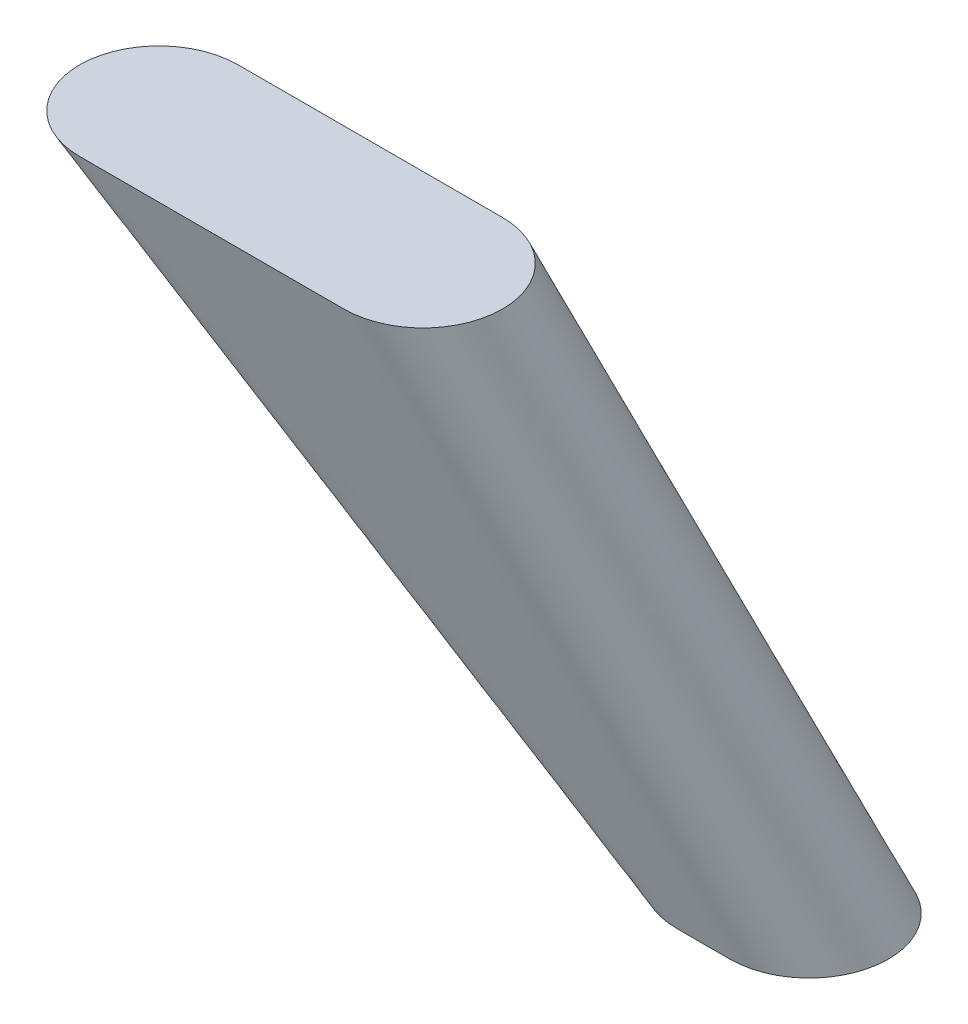
ISO-10303-21;
HEADER;
FILE_DESCRIPTION(('STEP AP214'),'2;1');
FILE_NAME('part.step','',(''),(''),'','','');
FILE_SCHEMA(('AUTOMOTIVE_DESIGN { 1 0 10303 214 1 1 1 1 }'));
ENDSEC;
DATA;
#1=APPLICATION_CONTEXT('core data for automotive mechanical design processes');
#2=APPLICATION_PROTOCOL_DEFINITION('international standard','automotive_design',2000,#1);
#3=PRODUCT_CONTEXT('',#1,'mechanical');
#4=PRODUCT('Part','Part','',(#3));
#5=PRODUCT_RELATED_PRODUCT_CATEGORY('part','',(#4));
#6=PRODUCT_DEFINITION_FORMATION('','',#4);
#7=PRODUCT_DEFINITION_CONTEXT('part definition',#1,'design');
#8=PRODUCT_DEFINITION('design','',#6,#7);
#9=PRODUCT_DEFINITION_SHAPE('','',#8);
#10=(LENGTH_UNIT() NAMED_UNIT(*) SI_UNIT(.MILLI.,.METRE.));
#11=(NAMED_UNIT(*) PLANE_ANGLE_UNIT() SI_UNIT($,.RADIAN.));
#12=(NAMED_UNIT(*) SI_UNIT($,.STERADIAN.) SOLID_ANGLE_UNIT());
#13=UNCERTAINTY_MEASURE_WITH_UNIT(LENGTH_MEASURE(1.E-05),#10,'distance_accuracy_value','');
#14=(GEOMETRIC_REPRESENTATION_CONTEXT(3) GLOBAL_UNCERTAINTY_ASSIGNED_CONTEXT((#13)) GLOBAL_UNIT_ASSIGNED_CONTEXT((#10,
#11,#12)) REPRESENTATION_CONTEXT('',''));
#15=CARTESIAN_POINT('',(0.,0.,0.));
#16=DIRECTION('',(0.,0.,1.));
#17=DIRECTION('',(1.,0.,0.));
#18=AXIS2_PLACEMENT_3D('',#15,#16,#17);
#19=CARTESIAN_POINT('',(-0.5,0.,0.));
#20=DIRECTION('',(0.,1.,0.));
#21=DIRECTION('',(0.,0.,1.));
#22=AXIS2_PLACEMENT_3D('',#19,#20,#21);
#23=PLANE('',#22);
#24=CARTESIAN_POINT('',(-0.5,0.,0.));
#25=DIRECTION('',(0.,1.,0.));
#26=DIRECTION('',(0.,0.,1.));
#27=AXIS2_PLACEMENT_3D('',#24,#25,#26);
#28=CIRCLE('',#27,1.5);
#29=CARTESIAN_POINT('',(-0.5,0.,-1.5));
#30=VERTEX_POINT('',#29);
#31=CARTESIAN_POINT('',(-0.5,0.,1.5));
#32=VERTEX_POINT('',#31);
#33=EDGE_CURVE('E176',#30,#32,#28,.T.);
#34=ORIENTED_EDGE('',*,*,#33,.F.);
#35=DIRECTION('',(-1.,0.,0.));
#36=VECTOR('',#35,1.);
#37=CARTESIAN_POINT('',(-0.5,0.,-1.5));
#38=LINE('',#37,#36);
#39=CARTESIAN_POINT('',(0.499999999999999,0.,-1.5));
#40=VERTEX_POINT('',#39);
#41=EDGE_CURVE('E184',#40,#30,#38,.T.);
#42=ORIENTED_EDGE('',*,*,#41,.F.);
#43=CARTESIAN_POINT('',(0.5,0.,0.));
#44=DIRECTION('',(0.,1.,0.));
#45=DIRECTION('',(0.,0.,1.));
#46=AXIS2_PLACEMENT_3D('',#43,#44,#45);
#47=CIRCLE('',#46,1.5);
#48=CARTESIAN_POINT('',(0.500000000000001,0.,1.5));
#49=VERTEX_POINT('',#48);
#50=EDGE_CURVE('E169',#49,#40,#47,.T.);
#51=ORIENTED_EDGE('',*,*,#50,.F.);
#52=DIRECTION('',(1.,0.,0.));
#53=VECTOR('',#52,1.);
#54=CARTESIAN_POINT('',(-0.5,0.,1.5));
#55=LINE('',#54,#53);
#56=EDGE_CURVE('E173',#32,#49,#55,.T.);
#57=ORIENTED_EDGE('',*,*,#56,.F.);
#58=EDGE_LOOP('',(#34,#42,#51,#57));
#59=FACE_BOUND('',#58,.T.);
#60=ADVANCED_FACE('F131',(#59),#23,.F.);
#61=CARTESIAN_POINT('',(-8.3,10.5,3.5));
#62=DIRECTION('',(0.,1.,0.));
#63=DIRECTION('',(0.,0.,1.));
#64=AXIS2_PLACEMENT_3D('',#61,#62,#63);
#65=PLANE('',#64);
#66=CARTESIAN_POINT('',(-8.3,10.5,3.5));
#67=DIRECTION('',(0.,1.,0.));
#68=DIRECTION('',(0.,0.,1.));
#69=AXIS2_PLACEMENT_3D('',#66,#67,#68);
#70=CIRCLE('',#69,1.5);
#71=CARTESIAN_POINT('',(-8.3,10.5,2.));
#72=VERTEX_POINT('',#71);
#73=CARTESIAN_POINT('',(-8.29999999999341,10.5,5.));
#74=VERTEX_POINT('',#73);
#75=EDGE_CURVE('E247',#72,#74,#70,.T.);
#76=ORIENTED_EDGE('',*,*,#75,.T.);
#77=DIRECTION('',(1.,0.,0.));
#78=VECTOR('',#77,1.);
#79=CARTESIAN_POINT('',(-8.3,10.5,5.));
#80=LINE('',#79,#78);
#81=CARTESIAN_POINT('',(-3.29999999991619,10.5,5.));
#82=VERTEX_POINT('',#81);
#83=EDGE_CURVE('E275',#74,#82,#80,.T.);
#84=ORIENTED_EDGE('',*,*,#83,.T.);
#85=CARTESIAN_POINT('',(-3.3,10.5,3.5));
#86=DIRECTION('',(0.,1.,0.));
#87=DIRECTION('',(0.,0.,1.));
#88=AXIS2_PLACEMENT_3D('',#85,#86,#87);
#89=CIRCLE('',#88,1.5);
#90=CARTESIAN_POINT('',(-3.3,10.5,2.));
#91=VERTEX_POINT('',#90);
#92=EDGE_CURVE('E142',#82,#91,#89,.T.);
#93=ORIENTED_EDGE('',*,*,#92,.T.);
#94=DIRECTION('',(-1.,0.,0.));
#95=VECTOR('',#94,1.);
#96=CARTESIAN_POINT('',(-8.3,10.5,2.));
#97=LINE('',#96,#95);
#98=EDGE_CURVE('E12',#91,#72,#97,.T.);
#99=ORIENTED_EDGE('',*,*,#98,.T.);
#100=EDGE_LOOP('',(#76,#84,#93,#99));
#101=FACE_BOUND('',#100,.T.);
#102=ADVANCED_FACE('F206',(#101),#65,.T.);
#103=CARTESIAN_POINT('',(-8.29999999891492,10.5,2.));
#104=CARTESIAN_POINT('',(-0.499999999361803,0.,-1.5));
#105=CARTESIAN_POINT('',(-8.02082364887283,10.5,2.));
#106=CARTESIAN_POINT('',(-0.335801066556987,0.,-1.5));
#107=CARTESIAN_POINT('',(-7.41053064299543,10.5,2.));
#108=CARTESIAN_POINT('',(-0.21524327309147,0.,-1.5));
#109=CARTESIAN_POINT('',(-5.8,10.5,2.));
#110=CARTESIAN_POINT('',(0.,0.,-1.5));
#111=CARTESIAN_POINT('',(-4.18946935700456,10.5,2.));
#112=CARTESIAN_POINT('',(0.21524327309147,0.,-1.5));
#113=CARTESIAN_POINT('',(-3.57917635112717,10.5,2.));
#114=CARTESIAN_POINT('',(0.335801066556986,0.,-1.5));
#115=CARTESIAN_POINT('',(-3.03490530349632,10.5,2.));
#116=CARTESIAN_POINT('',(0.655916739550319,0.,-1.5));
#117=CARTESIAN_POINT('',(-2.59425007172228,10.5,2.13008624908673));
#118=CARTESIAN_POINT('',(0.987820479615283,0.,-1.45144577340696));
#119=CARTESIAN_POINT('',(-2.13287848129319,10.5,2.50237550484088));
#120=CARTESIAN_POINT('',(1.49133360235256,0.,-1.17868140016491));
#121=CARTESIAN_POINT('',(-1.86060889529044,10.5,2.97881490364547));
#122=CARTESIAN_POINT('',(1.89396631949656,0.,-0.675979940046169));
#123=CARTESIAN_POINT('',(-1.76961596204744,10.5,3.49999999999999));
#124=CARTESIAN_POINT('',(2.0534597682229,0.,0.));
#125=CARTESIAN_POINT('',(-1.86060889529044,10.5,4.02118509635454));
#126=CARTESIAN_POINT('',(1.89396631949657,0.,0.675979940046167));
#127=CARTESIAN_POINT('',(-2.13287848129319,10.5,4.49762449515911));
#128=CARTESIAN_POINT('',(1.49133360235256,0.,1.17868140016491));
#129=CARTESIAN_POINT('',(-2.59425007172229,10.5,4.86991375091328));
#130=CARTESIAN_POINT('',(0.987820479615285,0.,1.45144577340695));
#131=CARTESIAN_POINT('',(-3.03490530349632,10.5,5.));
#132=CARTESIAN_POINT('',(0.65591673955032,0.,1.5));
#133=CARTESIAN_POINT('',(-3.57917635112717,10.5,5.));
#134=CARTESIAN_POINT('',(0.335801066556987,0.,1.5));
#135=CARTESIAN_POINT('',(-4.18946935700456,10.5,5.));
#136=CARTESIAN_POINT('',(0.21524327309147,0.,1.5));
#137=CARTESIAN_POINT('',(-5.8,10.5,5.));
#138=CARTESIAN_POINT('',(0.,0.,1.5));
#139=CARTESIAN_POINT('',(-7.41053064299543,10.5,5.));
#140=CARTESIAN_POINT('',(-0.21524327309147,0.,1.5));
#141=CARTESIAN_POINT('',(-8.02082364887283,10.5,5.));
#142=CARTESIAN_POINT('',(-0.335801066556986,0.,1.5));
#143=CARTESIAN_POINT('',(-8.56509469650368,10.5,5.));
#144=CARTESIAN_POINT('',(-0.655916739550319,0.,1.5));
#145=CARTESIAN_POINT('',(-9.00574992827771,10.5,4.86991375091327));
#146=CARTESIAN_POINT('',(-0.987820479615283,0.,1.45144577340696));
#147=CARTESIAN_POINT('',(-9.46712151870681,10.5,4.49762449515912));
#148=CARTESIAN_POINT('',(-1.49133360235256,0.,1.17868140016491));
#149=CARTESIAN_POINT('',(-9.73939110470955,10.5,4.02118509635452));
#150=CARTESIAN_POINT('',(-1.89396631949656,0.,0.67597994004617));
#151=CARTESIAN_POINT('',(-9.83038403795257,10.5,3.5));
#152=CARTESIAN_POINT('',(-2.0534597682229,0.,0.));
#153=CARTESIAN_POINT('',(-9.73939110470957,10.5,2.97881490364547));
#154=CARTESIAN_POINT('',(-1.89396631949656,0.,-0.675979940046165));
#155=CARTESIAN_POINT('',(-9.46712151870679,10.5,2.50237550484088));
#156=CARTESIAN_POINT('',(-1.49133360235256,0.,-1.17868140016491));
#157=CARTESIAN_POINT('',(-9.00574992827772,10.5,2.13008624908673));
#158=CARTESIAN_POINT('',(-0.987820479615287,0.,-1.45144577340695));
#159=CARTESIAN_POINT('',(-8.56509469650368,10.5,2.));
#160=CARTESIAN_POINT('',(-0.655916739550319,0.,-1.5));
#161=CARTESIAN_POINT('',(-8.29999999891492,10.5,2.));
#162=CARTESIAN_POINT('',(-0.499999999361803,0.,-1.5));
#163=B_SPLINE_SURFACE_WITH_KNOTS('',3,1,((#103,#104),(#105,#106),(#107,#108),(#109,#110),(#111,
#112),(#113,#114),(#115,#116),(#117,#118),(#119,#120),(#121,#122),(#123,#124),(#125,#126),(#127,
#128),(#129,#130),(#131,#132),(#133,#134),(#135,#136),(#137,#138),(#139,#140),(#141,#142),(#143,
#144),(#145,#146),(#147,#148),(#149,#150),(#151,#152),(#153,#154),(#155,#156),(#157,#158),(#159,
#160),(#161,#162)),.UNSPECIFIED.,.T.,.F.,.F.,(4,1,1,1,2,1,1,1,1,1,1,1,2,1,1,1,2,1,1,1,1,1,1,1,
4),(2,2),(0.,0.043116531631558,0.0862330632631159,0.129349594894674,0.172466126526232,
0.213407860710453,0.254349594894674,0.295291329078895,0.336233063263116,0.377174797447337,
0.418116531631558,0.459058265815779,0.5,0.543116531631558,0.586233063263116,0.629349594894674,
0.672466126526232,0.713407860710453,0.754349594894674,0.795291329078895,0.836233063263116,
0.877174797447337,0.918116531631558,0.959058265815779,1.),(0.,1.),.UNSPECIFIED.);
#164=ORIENTED_EDGE('',*,*,#92,.F.);
#165=ORIENTED_EDGE('',*,*,#83,.F.);
#166=ORIENTED_EDGE('',*,*,#75,.F.);
#167=ORIENTED_EDGE('',*,*,#98,.F.);
#168=EDGE_LOOP('',(#164,#165,#166,#167));
#169=FACE_BOUND('',#168,.T.);
#170=ORIENTED_EDGE('',*,*,#41,.T.);
#171=ORIENTED_EDGE('',*,*,#33,.T.);
#172=ORIENTED_EDGE('',*,*,#56,.T.);
#173=ORIENTED_EDGE('',*,*,#50,.T.);
#174=EDGE_LOOP('',(#170,#171,#172,#173));
#175=FACE_BOUND('',#174,.T.);
#176=ADVANCED_FACE('F183',(#169,#175),#163,.T.);
#177=CLOSED_SHELL('',(#60,#102,#176));
#178=MANIFOLD_SOLID_BREP('B2',#177);
#179=ADVANCED_BREP_SHAPE_REPRESENTATION('',(#18,#178),#14);
#180=SHAPE_DEFINITION_REPRESENTATION(#9,#179);
ENDSEC;
END-ISO-10303-21;
